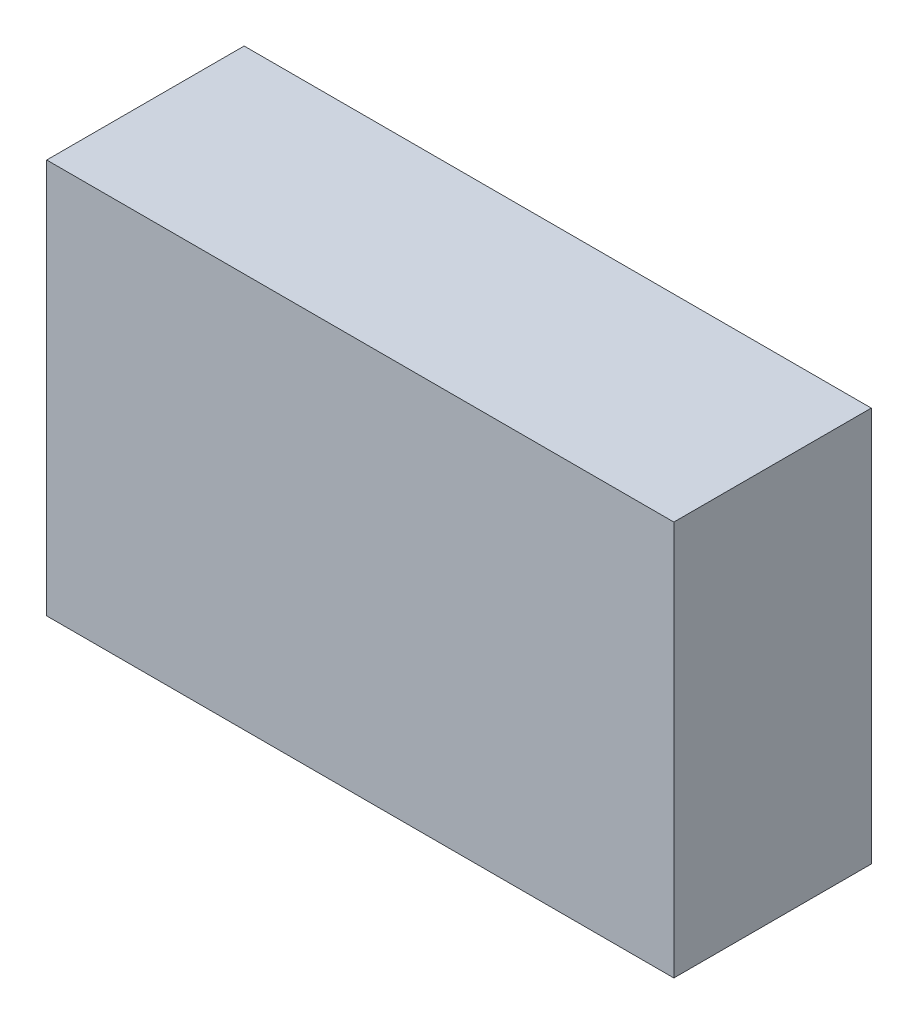
ISO-10303-21;
HEADER;
FILE_DESCRIPTION(('STEP AP214'),'2;1');
FILE_NAME('part.step','',(''),(''),'','','');
FILE_SCHEMA(('AUTOMOTIVE_DESIGN { 1 0 10303 214 1 1 1 1 }'));
ENDSEC;
DATA;
#1=APPLICATION_CONTEXT('core data for automotive mechanical design processes');
#2=APPLICATION_PROTOCOL_DEFINITION('international standard','automotive_design',2000,#1);
#3=PRODUCT_CONTEXT('',#1,'mechanical');
#4=PRODUCT('Part','Part','',(#3));
#5=PRODUCT_RELATED_PRODUCT_CATEGORY('part','',(#4));
#6=PRODUCT_DEFINITION_FORMATION('','',#4);
#7=PRODUCT_DEFINITION_CONTEXT('part definition',#1,'design');
#8=PRODUCT_DEFINITION('design','',#6,#7);
#9=PRODUCT_DEFINITION_SHAPE('','',#8);
#10=(LENGTH_UNIT() NAMED_UNIT(*) SI_UNIT(.MILLI.,.METRE.));
#11=(NAMED_UNIT(*) PLANE_ANGLE_UNIT() SI_UNIT($,.RADIAN.));
#12=(NAMED_UNIT(*) SI_UNIT($,.STERADIAN.) SOLID_ANGLE_UNIT());
#13=UNCERTAINTY_MEASURE_WITH_UNIT(LENGTH_MEASURE(1.E-05),#10,'distance_accuracy_value','');
#14=(GEOMETRIC_REPRESENTATION_CONTEXT(3) GLOBAL_UNCERTAINTY_ASSIGNED_CONTEXT((#13)) GLOBAL_UNIT_ASSIGNED_CONTEXT((#10,
#11,#12)) REPRESENTATION_CONTEXT('',''));
#15=CARTESIAN_POINT('',(0.,0.,0.));
#16=DIRECTION('',(0.,0.,1.));
#17=DIRECTION('',(1.,0.,0.));
#18=AXIS2_PLACEMENT_3D('',#15,#16,#17);
#19=CARTESIAN_POINT('',(1.34999984,-0.85000084,0.));
#20=DIRECTION('',(-1.,0.,0.));
#21=DIRECTION('',(0.,1.,0.));
#22=AXIS2_PLACEMENT_3D('',#19,#20,#21);
#23=PLANE('',#22);
#24=DIRECTION('',(0.,1.,0.));
#25=VECTOR('',#24,1.);
#26=CARTESIAN_POINT('',(1.34999984,-0.85000084,0.));
#27=LINE('',#26,#25);
#28=CARTESIAN_POINT('',(1.34999984,-0.85000084,0.));
#29=VERTEX_POINT('',#28);
#30=CARTESIAN_POINT('',(1.34999984,0.85000084,0.));
#31=VERTEX_POINT('',#30);
#32=EDGE_CURVE('E11',#29,#31,#27,.T.);
#33=ORIENTED_EDGE('',*,*,#32,.T.);
#34=DIRECTION('',(0.,0.,1.));
#35=VECTOR('',#34,1.);
#36=CARTESIAN_POINT('',(1.34999984,0.85000084,0.));
#37=LINE('',#36,#35);
#38=CARTESIAN_POINT('',(1.34999984,0.85000084,0.85000084));
#39=VERTEX_POINT('',#38);
#40=EDGE_CURVE('E25',#31,#39,#37,.T.);
#41=ORIENTED_EDGE('',*,*,#40,.T.);
#42=DIRECTION('',(0.,1.,0.));
#43=VECTOR('',#42,1.);
#44=CARTESIAN_POINT('',(1.34999984,-0.85000084,0.85000084));
#45=LINE('',#44,#43);
#46=CARTESIAN_POINT('',(1.34999984,-0.85000084,0.85000084));
#47=VERTEX_POINT('',#46);
#48=EDGE_CURVE('E105',#47,#39,#45,.T.);
#49=ORIENTED_EDGE('',*,*,#48,.F.);
#50=DIRECTION('',(0.,0.,1.));
#51=VECTOR('',#50,1.);
#52=CARTESIAN_POINT('',(1.34999984,-0.85000084,0.));
#53=LINE('',#52,#51);
#54=EDGE_CURVE('E43',#29,#47,#53,.T.);
#55=ORIENTED_EDGE('',*,*,#54,.F.);
#56=EDGE_LOOP('',(#33,#41,#49,#55));
#57=FACE_BOUND('',#56,.T.);
#58=ADVANCED_FACE('F17',(#57),#23,.F.);
#59=CARTESIAN_POINT('',(1.34999984,0.85000084,0.));
#60=DIRECTION('',(0.,-1.,0.));
#61=DIRECTION('',(-1.,0.,0.));
#62=AXIS2_PLACEMENT_3D('',#59,#60,#61);
#63=PLANE('',#62);
#64=DIRECTION('',(-1.,0.,0.));
#65=VECTOR('',#64,1.);
#66=CARTESIAN_POINT('',(1.34999984,0.85000084,0.));
#67=LINE('',#66,#65);
#68=CARTESIAN_POINT('',(-1.34999984,0.85000084,0.));
#69=VERTEX_POINT('',#68);
#70=EDGE_CURVE('E100',#31,#69,#67,.T.);
#71=ORIENTED_EDGE('',*,*,#70,.T.);
#72=DIRECTION('',(0.,0.,1.));
#73=VECTOR('',#72,1.);
#74=CARTESIAN_POINT('',(-1.34999984,0.85000084,0.));
#75=LINE('',#74,#73);
#76=CARTESIAN_POINT('',(-1.34999984,0.85000084,0.85000084));
#77=VERTEX_POINT('',#76);
#78=EDGE_CURVE('E97',#69,#77,#75,.T.);
#79=ORIENTED_EDGE('',*,*,#78,.T.);
#80=DIRECTION('',(-1.,0.,0.));
#81=VECTOR('',#80,1.);
#82=CARTESIAN_POINT('',(1.34999984,0.85000084,0.85000084));
#83=LINE('',#82,#81);
#84=EDGE_CURVE('E71',#39,#77,#83,.T.);
#85=ORIENTED_EDGE('',*,*,#84,.F.);
#86=ORIENTED_EDGE('',*,*,#40,.F.);
#87=EDGE_LOOP('',(#71,#79,#85,#86));
#88=FACE_BOUND('',#87,.T.);
#89=ADVANCED_FACE('F109',(#88),#63,.F.);
#90=CARTESIAN_POINT('',(-1.34999984,0.85000084,0.));
#91=DIRECTION('',(1.,0.,0.));
#92=DIRECTION('',(0.,-1.,0.));
#93=AXIS2_PLACEMENT_3D('',#90,#91,#92);
#94=PLANE('',#93);
#95=DIRECTION('',(0.,-1.,0.));
#96=VECTOR('',#95,1.);
#97=CARTESIAN_POINT('',(-1.34999984,0.85000084,0.));
#98=LINE('',#97,#96);
#99=CARTESIAN_POINT('',(-1.34999984,-0.85000084,0.));
#100=VERTEX_POINT('',#99);
#101=EDGE_CURVE('E81',#69,#100,#98,.T.);
#102=ORIENTED_EDGE('',*,*,#101,.T.);
#103=DIRECTION('',(0.,0.,1.));
#104=VECTOR('',#103,1.);
#105=CARTESIAN_POINT('',(-1.34999984,-0.85000084,0.));
#106=LINE('',#105,#104);
#107=CARTESIAN_POINT('',(-1.34999984,-0.85000084,0.85000084));
#108=VERTEX_POINT('',#107);
#109=EDGE_CURVE('E75',#100,#108,#106,.T.);
#110=ORIENTED_EDGE('',*,*,#109,.T.);
#111=DIRECTION('',(0.,-1.,0.));
#112=VECTOR('',#111,1.);
#113=CARTESIAN_POINT('',(-1.34999984,0.85000084,0.85000084));
#114=LINE('',#113,#112);
#115=EDGE_CURVE('E66',#77,#108,#114,.T.);
#116=ORIENTED_EDGE('',*,*,#115,.F.);
#117=ORIENTED_EDGE('',*,*,#78,.F.);
#118=EDGE_LOOP('',(#102,#110,#116,#117));
#119=FACE_BOUND('',#118,.T.);
#120=ADVANCED_FACE('F79',(#119),#94,.F.);
#121=CARTESIAN_POINT('',(-1.34999984,-0.85000084,0.));
#122=DIRECTION('',(0.,1.,0.));
#123=DIRECTION('',(1.,0.,0.));
#124=AXIS2_PLACEMENT_3D('',#121,#122,#123);
#125=PLANE('',#124);
#126=DIRECTION('',(1.,0.,0.));
#127=VECTOR('',#126,1.);
#128=CARTESIAN_POINT('',(-1.34999984,-0.85000084,0.));
#129=LINE('',#128,#127);
#130=EDGE_CURVE('E76',#100,#29,#129,.T.);
#131=ORIENTED_EDGE('',*,*,#130,.T.);
#132=ORIENTED_EDGE('',*,*,#54,.T.);
#133=DIRECTION('',(1.,0.,0.));
#134=VECTOR('',#133,1.);
#135=CARTESIAN_POINT('',(-1.34999984,-0.85000084,0.85000084));
#136=LINE('',#135,#134);
#137=EDGE_CURVE('E70',#108,#47,#136,.T.);
#138=ORIENTED_EDGE('',*,*,#137,.F.);
#139=ORIENTED_EDGE('',*,*,#109,.F.);
#140=EDGE_LOOP('',(#131,#132,#138,#139));
#141=FACE_BOUND('',#140,.T.);
#142=ADVANCED_FACE('F86',(#141),#125,.F.);
#143=CARTESIAN_POINT('',(1.34999984,-0.85000084,0.));
#144=DIRECTION('',(0.,0.,-1.));
#145=DIRECTION('',(-1.,0.,0.));
#146=AXIS2_PLACEMENT_3D('',#143,#144,#145);
#147=PLANE('',#146);
#148=ORIENTED_EDGE('',*,*,#130,.F.);
#149=ORIENTED_EDGE('',*,*,#101,.F.);
#150=ORIENTED_EDGE('',*,*,#70,.F.);
#151=ORIENTED_EDGE('',*,*,#32,.F.);
#152=EDGE_LOOP('',(#148,#149,#150,#151));
#153=FACE_BOUND('',#152,.T.);
#154=ADVANCED_FACE('F111',(#153),#147,.T.);
#155=CARTESIAN_POINT('',(1.34999984,-0.85000084,0.85000084));
#156=DIRECTION('',(0.,0.,-1.));
#157=DIRECTION('',(-1.,0.,0.));
#158=AXIS2_PLACEMENT_3D('',#155,#156,#157);
#159=PLANE('',#158);
#160=ORIENTED_EDGE('',*,*,#48,.T.);
#161=ORIENTED_EDGE('',*,*,#84,.T.);
#162=ORIENTED_EDGE('',*,*,#115,.T.);
#163=ORIENTED_EDGE('',*,*,#137,.T.);
#164=EDGE_LOOP('',(#160,#161,#162,#163));
#165=FACE_BOUND('',#164,.T.);
#166=ADVANCED_FACE('F68',(#165),#159,.F.);
#167=CLOSED_SHELL('',(#58,#89,#120,#142,#154,#166));
#168=MANIFOLD_SOLID_BREP('B1',#167);
#169=ADVANCED_BREP_SHAPE_REPRESENTATION('',(#18,#168),#14);
#170=SHAPE_DEFINITION_REPRESENTATION(#9,#169);
ENDSEC;
END-ISO-10303-21;
